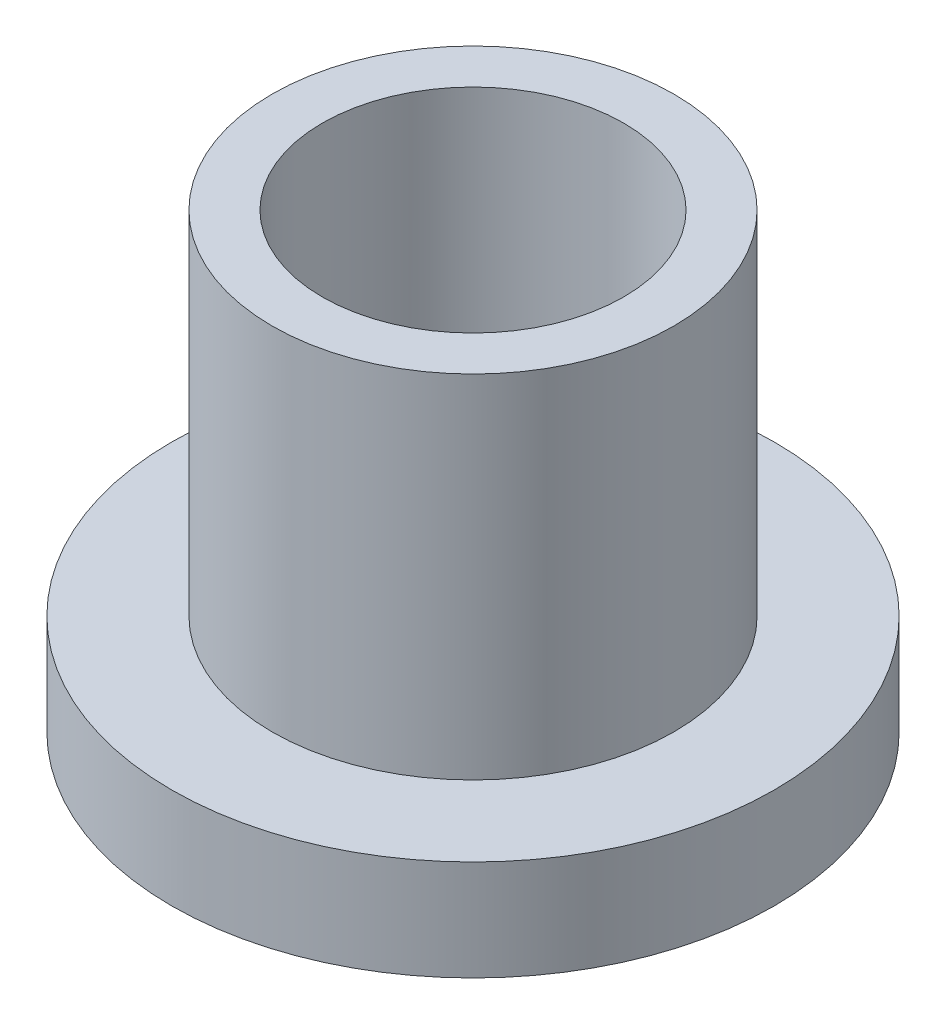
ISO-10303-21;
HEADER;
FILE_DESCRIPTION(('STEP AP214'),'2;1');
FILE_NAME('part.step','',(''),(''),'','','');
FILE_SCHEMA(('AUTOMOTIVE_DESIGN { 1 0 10303 214 1 1 1 1 }'));
ENDSEC;
DATA;
#1=APPLICATION_CONTEXT('core data for automotive mechanical design processes');
#2=APPLICATION_PROTOCOL_DEFINITION('international standard','automotive_design',2000,#1);
#3=PRODUCT_CONTEXT('',#1,'mechanical');
#4=PRODUCT('Part','Part','',(#3));
#5=PRODUCT_RELATED_PRODUCT_CATEGORY('part','',(#4));
#6=PRODUCT_DEFINITION_FORMATION('','',#4);
#7=PRODUCT_DEFINITION_CONTEXT('part definition',#1,'design');
#8=PRODUCT_DEFINITION('design','',#6,#7);
#9=PRODUCT_DEFINITION_SHAPE('','',#8);
#10=(LENGTH_UNIT() NAMED_UNIT(*) SI_UNIT(.MILLI.,.METRE.));
#11=(NAMED_UNIT(*) PLANE_ANGLE_UNIT() SI_UNIT($,.RADIAN.));
#12=(NAMED_UNIT(*) SI_UNIT($,.STERADIAN.) SOLID_ANGLE_UNIT());
#13=UNCERTAINTY_MEASURE_WITH_UNIT(LENGTH_MEASURE(1.E-05),#10,'distance_accuracy_value','');
#14=(GEOMETRIC_REPRESENTATION_CONTEXT(3) GLOBAL_UNCERTAINTY_ASSIGNED_CONTEXT((#13)) GLOBAL_UNIT_ASSIGNED_CONTEXT((#10,
#11,#12)) REPRESENTATION_CONTEXT('',''));
#15=CARTESIAN_POINT('',(0.,0.,0.));
#16=DIRECTION('',(0.,0.,1.));
#17=DIRECTION('',(1.,0.,0.));
#18=AXIS2_PLACEMENT_3D('',#15,#16,#17);
#19=CARTESIAN_POINT('',(0.,7.,0.));
#20=DIRECTION('',(0.,1.,0.));
#21=DIRECTION('',(0.,0.,1.));
#22=AXIS2_PLACEMENT_3D('',#19,#20,#21);
#23=PLANE('',#22);
#24=CARTESIAN_POINT('',(0.,7.,0.));
#25=DIRECTION('',(0.,1.,0.));
#26=DIRECTION('',(0.,0.,1.));
#27=AXIS2_PLACEMENT_3D('',#24,#25,#26);
#28=CIRCLE('',#27,4.);
#29=CARTESIAN_POINT('',(0.,7.,4.));
#30=VERTEX_POINT('',#29);
#31=EDGE_CURVE('E10',#30,#30,#28,.T.);
#32=ORIENTED_EDGE('',*,*,#31,.T.);
#33=EDGE_LOOP('',(#32));
#34=FACE_BOUND('',#33,.T.);
#35=CARTESIAN_POINT('',(0.,7.,0.));
#36=DIRECTION('',(0.,1.,0.));
#37=DIRECTION('',(0.,0.,1.));
#38=AXIS2_PLACEMENT_3D('',#35,#36,#37);
#39=CIRCLE('',#38,3.);
#40=CARTESIAN_POINT('',(0.,7.,3.));
#41=VERTEX_POINT('',#40);
#42=EDGE_CURVE('E45',#41,#41,#39,.T.);
#43=ORIENTED_EDGE('',*,*,#42,.F.);
#44=EDGE_LOOP('',(#43));
#45=FACE_BOUND('',#44,.T.);
#46=ADVANCED_FACE('F37',(#34,#45),#23,.T.);
#47=CARTESIAN_POINT('',(0.,7.,0.));
#48=DIRECTION('',(0.,-1.,0.));
#49=DIRECTION('',(0.,0.,-1.));
#50=AXIS2_PLACEMENT_3D('',#47,#48,#49);
#51=CYLINDRICAL_SURFACE('',#50,4.);
#52=ORIENTED_EDGE('',*,*,#31,.F.);
#53=EDGE_LOOP('',(#52));
#54=FACE_BOUND('',#53,.T.);
#55=CARTESIAN_POINT('',(0.,0.,0.));
#56=DIRECTION('',(0.,1.,0.));
#57=DIRECTION('',(0.,0.,1.));
#58=AXIS2_PLACEMENT_3D('',#55,#56,#57);
#59=CIRCLE('',#58,4.);
#60=CARTESIAN_POINT('',(0.,0.,4.));
#61=VERTEX_POINT('',#60);
#62=EDGE_CURVE('E41',#61,#61,#59,.T.);
#63=ORIENTED_EDGE('',*,*,#62,.T.);
#64=EDGE_LOOP('',(#63));
#65=FACE_BOUND('',#64,.T.);
#66=ADVANCED_FACE('F39',(#54,#65),#51,.T.);
#67=CARTESIAN_POINT('',(0.,7.,0.));
#68=DIRECTION('',(0.,-1.,0.));
#69=DIRECTION('',(0.,0.,-1.));
#70=AXIS2_PLACEMENT_3D('',#67,#68,#69);
#71=CYLINDRICAL_SURFACE('',#70,3.);
#72=ORIENTED_EDGE('',*,*,#42,.T.);
#73=EDGE_LOOP('',(#72));
#74=FACE_BOUND('',#73,.T.);
#75=CARTESIAN_POINT('',(0.,-2.,0.));
#76=DIRECTION('',(0.,-1.,0.));
#77=DIRECTION('',(0.,0.,-1.));
#78=AXIS2_PLACEMENT_3D('',#75,#76,#77);
#79=CIRCLE('',#78,3.);
#80=CARTESIAN_POINT('',(0.,-2.,-3.));
#81=VERTEX_POINT('',#80);
#82=EDGE_CURVE('E55',#81,#81,#79,.T.);
#83=ORIENTED_EDGE('',*,*,#82,.T.);
#84=EDGE_LOOP('',(#83));
#85=FACE_BOUND('',#84,.T.);
#86=ADVANCED_FACE('F61',(#74,#85),#71,.F.);
#87=CARTESIAN_POINT('',(0.,-2.,0.));
#88=DIRECTION('',(0.,-1.,0.));
#89=DIRECTION('',(0.,0.,-1.));
#90=AXIS2_PLACEMENT_3D('',#87,#88,#89);
#91=PLANE('',#90);
#92=CARTESIAN_POINT('',(0.,-2.,0.));
#93=DIRECTION('',(0.,-1.,0.));
#94=DIRECTION('',(0.,0.,-1.));
#95=AXIS2_PLACEMENT_3D('',#92,#93,#94);
#96=CIRCLE('',#95,6.);
#97=CARTESIAN_POINT('',(0.,-2.,-6.));
#98=VERTEX_POINT('',#97);
#99=EDGE_CURVE('E54',#98,#98,#96,.T.);
#100=ORIENTED_EDGE('',*,*,#99,.T.);
#101=EDGE_LOOP('',(#100));
#102=FACE_BOUND('',#101,.T.);
#103=ORIENTED_EDGE('',*,*,#82,.F.);
#104=EDGE_LOOP('',(#103));
#105=FACE_BOUND('',#104,.T.);
#106=ADVANCED_FACE('F63',(#102,#105),#91,.T.);
#107=CARTESIAN_POINT('',(0.,0.,0.));
#108=DIRECTION('',(0.,-1.,0.));
#109=DIRECTION('',(0.,0.,-1.));
#110=AXIS2_PLACEMENT_3D('',#107,#108,#109);
#111=PLANE('',#110);
#112=ORIENTED_EDGE('',*,*,#62,.F.);
#113=EDGE_LOOP('',(#112));
#114=FACE_BOUND('',#113,.T.);
#115=CARTESIAN_POINT('',(0.,0.,0.));
#116=DIRECTION('',(0.,-1.,0.));
#117=DIRECTION('',(0.,0.,-1.));
#118=AXIS2_PLACEMENT_3D('',#115,#116,#117);
#119=CIRCLE('',#118,6.);
#120=CARTESIAN_POINT('',(0.,0.,-6.));
#121=VERTEX_POINT('',#120);
#122=EDGE_CURVE('E51',#121,#121,#119,.T.);
#123=ORIENTED_EDGE('',*,*,#122,.F.);
#124=EDGE_LOOP('',(#123));
#125=FACE_BOUND('',#124,.T.);
#126=ADVANCED_FACE('F65',(#114,#125),#111,.F.);
#127=CARTESIAN_POINT('',(0.,-2.,0.));
#128=DIRECTION('',(0.,1.,0.));
#129=DIRECTION('',(0.,0.,1.));
#130=AXIS2_PLACEMENT_3D('',#127,#128,#129);
#131=CYLINDRICAL_SURFACE('',#130,6.);
#132=ORIENTED_EDGE('',*,*,#99,.F.);
#133=EDGE_LOOP('',(#132));
#134=FACE_BOUND('',#133,.T.);
#135=ORIENTED_EDGE('',*,*,#122,.T.);
#136=EDGE_LOOP('',(#135));
#137=FACE_BOUND('',#136,.T.);
#138=ADVANCED_FACE('F72',(#134,#137),#131,.T.);
#139=CLOSED_SHELL('',(#46,#66,#86,#106,#126,#138));
#140=MANIFOLD_SOLID_BREP('B2',#139);
#141=ADVANCED_BREP_SHAPE_REPRESENTATION('',(#18,#140),#14);
#142=SHAPE_DEFINITION_REPRESENTATION(#9,#141);
ENDSEC;
END-ISO-10303-21;
